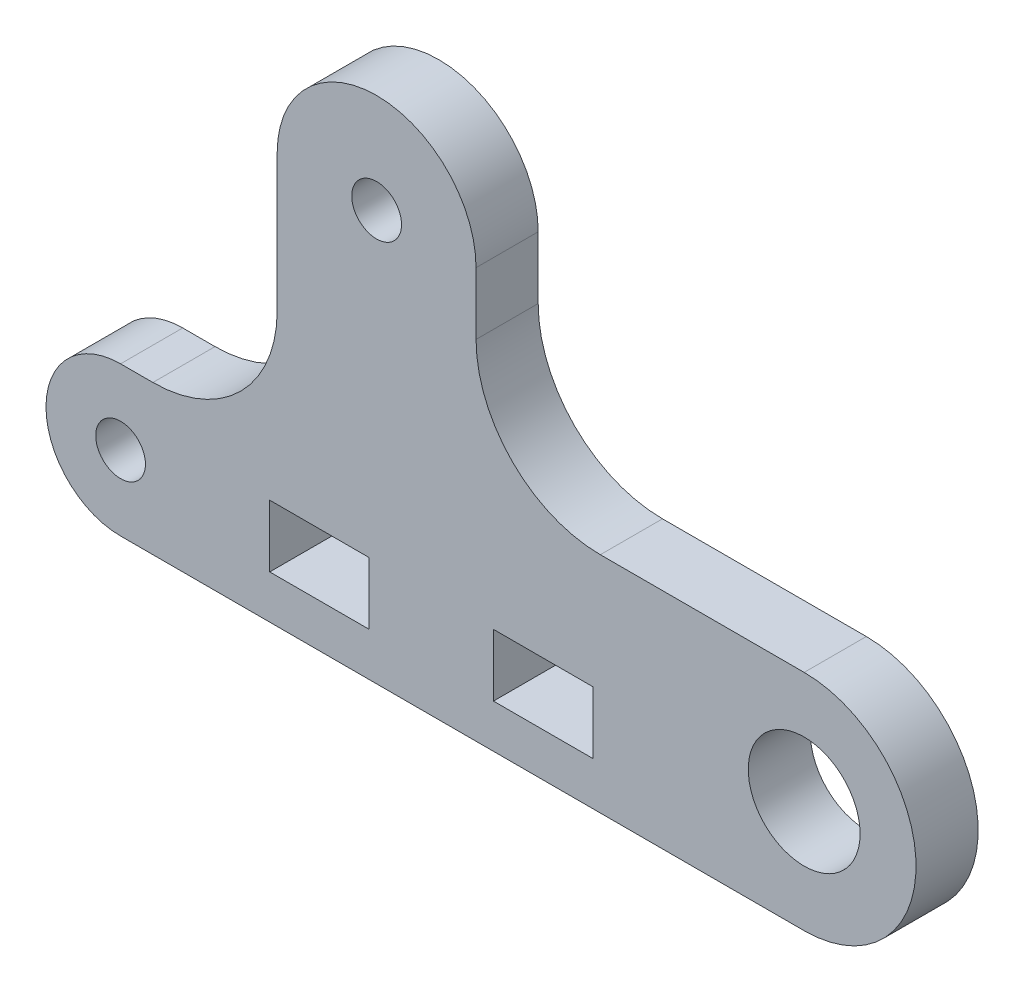
ISO-10303-21;
HEADER;
FILE_DESCRIPTION(('STEP AP214'),'2;1');
FILE_NAME('part.step','',(''),(''),'','','');
FILE_SCHEMA(('AUTOMOTIVE_DESIGN { 1 0 10303 214 1 1 1 1 }'));
ENDSEC;
DATA;
#1=APPLICATION_CONTEXT('core data for automotive mechanical design processes');
#2=APPLICATION_PROTOCOL_DEFINITION('international standard','automotive_design',2000,#1);
#3=PRODUCT_CONTEXT('',#1,'mechanical');
#4=PRODUCT('Part','Part','',(#3));
#5=PRODUCT_RELATED_PRODUCT_CATEGORY('part','',(#4));
#6=PRODUCT_DEFINITION_FORMATION('','',#4);
#7=PRODUCT_DEFINITION_CONTEXT('part definition',#1,'design');
#8=PRODUCT_DEFINITION('design','',#6,#7);
#9=PRODUCT_DEFINITION_SHAPE('','',#8);
#10=(LENGTH_UNIT() NAMED_UNIT(*) SI_UNIT(.MILLI.,.METRE.));
#11=(NAMED_UNIT(*) PLANE_ANGLE_UNIT() SI_UNIT($,.RADIAN.));
#12=(NAMED_UNIT(*) SI_UNIT($,.STERADIAN.) SOLID_ANGLE_UNIT());
#13=UNCERTAINTY_MEASURE_WITH_UNIT(LENGTH_MEASURE(1.E-05),#10,'distance_accuracy_value','');
#14=(GEOMETRIC_REPRESENTATION_CONTEXT(3) GLOBAL_UNCERTAINTY_ASSIGNED_CONTEXT((#13)) GLOBAL_UNIT_ASSIGNED_CONTEXT((#10,
#11,#12)) REPRESENTATION_CONTEXT('',''));
#15=CARTESIAN_POINT('',(0.,0.,0.));
#16=DIRECTION('',(0.,0.,1.));
#17=DIRECTION('',(1.,0.,0.));
#18=AXIS2_PLACEMENT_3D('',#15,#16,#17);
#19=CARTESIAN_POINT('',(-27.5,6.,2.5));
#20=DIRECTION('',(0.,0.,-1.));
#21=DIRECTION('',(-1.,0.,0.));
#22=AXIS2_PLACEMENT_3D('',#19,#20,#21);
#23=PLANE('',#22);
#24=DIRECTION('',(0.,-1.,0.));
#25=VECTOR('',#24,1.);
#26=CARTESIAN_POINT('',(-15.5,8.5,2.5));
#27=LINE('',#26,#25);
#28=CARTESIAN_POINT('',(-15.5,8.5,2.5));
#29=VERTEX_POINT('',#28);
#30=CARTESIAN_POINT('',(-15.5,3.5,2.5));
#31=VERTEX_POINT('',#30);
#32=EDGE_CURVE('E193',#29,#31,#27,.T.);
#33=ORIENTED_EDGE('',*,*,#32,.F.);
#34=DIRECTION('',(-1.,0.,0.));
#35=VECTOR('',#34,1.);
#36=CARTESIAN_POINT('',(-15.5,8.5,2.5));
#37=LINE('',#36,#35);
#38=CARTESIAN_POINT('',(-7.5,8.5,2.5));
#39=VERTEX_POINT('',#38);
#40=EDGE_CURVE('E201',#39,#29,#37,.T.);
#41=ORIENTED_EDGE('',*,*,#40,.F.);
#42=DIRECTION('',(0.,1.,0.));
#43=VECTOR('',#42,1.);
#44=CARTESIAN_POINT('',(-7.5,8.5,2.5));
#45=LINE('',#44,#43);
#46=CARTESIAN_POINT('',(-7.5,3.5,2.5));
#47=VERTEX_POINT('',#46);
#48=EDGE_CURVE('E198',#47,#39,#45,.T.);
#49=ORIENTED_EDGE('',*,*,#48,.F.);
#50=DIRECTION('',(1.,0.,0.));
#51=VECTOR('',#50,1.);
#52=CARTESIAN_POINT('',(-15.5,3.5,2.5));
#53=LINE('',#52,#51);
#54=EDGE_CURVE('E195',#31,#47,#53,.T.);
#55=ORIENTED_EDGE('',*,*,#54,.F.);
#56=EDGE_LOOP('',(#33,#41,#49,#55));
#57=FACE_BOUND('',#56,.T.);
#58=CARTESIAN_POINT('',(-27.5,6.,2.5));
#59=DIRECTION('',(0.,0.,1.));
#60=DIRECTION('',(-1.,0.,0.));
#61=AXIS2_PLACEMENT_3D('',#58,#59,#60);
#62=CIRCLE('',#61,6.);
#63=CARTESIAN_POINT('',(-27.5,12.,2.5));
#64=VERTEX_POINT('',#63);
#65=CARTESIAN_POINT('',(-27.5,0.,2.5));
#66=VERTEX_POINT('',#65);
#67=EDGE_CURVE('E242',#64,#66,#62,.T.);
#68=ORIENTED_EDGE('',*,*,#67,.T.);
#69=DIRECTION('',(1.,0.,0.));
#70=VECTOR('',#69,1.);
#71=CARTESIAN_POINT('',(-27.5,0.,2.5));
#72=LINE('',#71,#70);
#73=CARTESIAN_POINT('',(27.5,0.,2.5));
#74=VERTEX_POINT('',#73);
#75=EDGE_CURVE('E245',#66,#74,#72,.T.);
#76=ORIENTED_EDGE('',*,*,#75,.T.);
#77=CARTESIAN_POINT('',(27.5,9.,2.5));
#78=DIRECTION('',(0.,0.,1.));
#79=DIRECTION('',(1.,0.,0.));
#80=AXIS2_PLACEMENT_3D('',#77,#78,#79);
#81=CIRCLE('',#80,9.);
#82=CARTESIAN_POINT('',(27.5,18.,2.5));
#83=VERTEX_POINT('',#82);
#84=EDGE_CURVE('E248',#74,#83,#81,.T.);
#85=ORIENTED_EDGE('',*,*,#84,.T.);
#86=DIRECTION('',(-1.,0.,0.));
#87=VECTOR('',#86,1.);
#88=CARTESIAN_POINT('',(11.1000000000001,18.,2.5));
#89=LINE('',#88,#87);
#90=CARTESIAN_POINT('',(11.1000000000001,18.,2.5));
#91=VERTEX_POINT('',#90);
#92=EDGE_CURVE('E250',#83,#91,#89,.T.);
#93=ORIENTED_EDGE('',*,*,#92,.T.);
#94=CARTESIAN_POINT('',(11.1,28.,2.5));
#95=DIRECTION('',(0.,0.,-1.));
#96=DIRECTION('',(1.,0.,0.));
#97=AXIS2_PLACEMENT_3D('',#94,#95,#96);
#98=CIRCLE('',#97,10.);
#99=CARTESIAN_POINT('',(1.1,28.0000000000001,2.5));
#100=VERTEX_POINT('',#99);
#101=EDGE_CURVE('E252',#91,#100,#98,.T.);
#102=ORIENTED_EDGE('',*,*,#101,.T.);
#103=DIRECTION('',(0.,1.,0.));
#104=VECTOR('',#103,1.);
#105=CARTESIAN_POINT('',(1.1,33.,2.5));
#106=LINE('',#105,#104);
#107=CARTESIAN_POINT('',(1.1,33.,2.5));
#108=VERTEX_POINT('',#107);
#109=EDGE_CURVE('E254',#100,#108,#106,.T.);
#110=ORIENTED_EDGE('',*,*,#109,.T.);
#111=CARTESIAN_POINT('',(-6.9,33.,2.5));
#112=DIRECTION('',(0.,0.,1.));
#113=DIRECTION('',(-1.,0.,0.));
#114=AXIS2_PLACEMENT_3D('',#111,#112,#113);
#115=CIRCLE('',#114,8.);
#116=CARTESIAN_POINT('',(-14.9,33.,2.5));
#117=VERTEX_POINT('',#116);
#118=EDGE_CURVE('E256',#108,#117,#115,.T.);
#119=ORIENTED_EDGE('',*,*,#118,.T.);
#120=DIRECTION('',(0.,-1.,0.));
#121=VECTOR('',#120,1.);
#122=CARTESIAN_POINT('',(-14.9,22.0000000000001,2.5));
#123=LINE('',#122,#121);
#124=CARTESIAN_POINT('',(-14.9,22.0000000000001,2.5));
#125=VERTEX_POINT('',#124);
#126=EDGE_CURVE('E258',#117,#125,#123,.T.);
#127=ORIENTED_EDGE('',*,*,#126,.T.);
#128=CARTESIAN_POINT('',(-24.9,22.,2.5));
#129=DIRECTION('',(0.,0.,-1.));
#130=DIRECTION('',(1.,0.,0.));
#131=AXIS2_PLACEMENT_3D('',#128,#129,#130);
#132=CIRCLE('',#131,10.);
#133=CARTESIAN_POINT('',(-24.9000000000001,12.,2.5));
#134=VERTEX_POINT('',#133);
#135=EDGE_CURVE('E260',#125,#134,#132,.T.);
#136=ORIENTED_EDGE('',*,*,#135,.T.);
#137=DIRECTION('',(-1.,0.,0.));
#138=VECTOR('',#137,1.);
#139=CARTESIAN_POINT('',(-27.5,12.,2.5));
#140=LINE('',#139,#138);
#141=EDGE_CURVE('E262',#134,#64,#140,.T.);
#142=ORIENTED_EDGE('',*,*,#141,.T.);
#143=EDGE_LOOP('',(#68,#76,#85,#93,#102,#110,#119,#127,#136,#142));
#144=FACE_BOUND('',#143,.T.);
#145=CARTESIAN_POINT('',(27.5,9.,2.5));
#146=DIRECTION('',(0.,0.,1.));
#147=DIRECTION('',(1.,0.,0.));
#148=AXIS2_PLACEMENT_3D('',#145,#146,#147);
#149=CIRCLE('',#148,4.5);
#150=CARTESIAN_POINT('',(32.,9.,2.5));
#151=VERTEX_POINT('',#150);
#152=EDGE_CURVE('E236',#151,#151,#149,.T.);
#153=ORIENTED_EDGE('',*,*,#152,.F.);
#154=EDGE_LOOP('',(#153));
#155=FACE_BOUND('',#154,.T.);
#156=CARTESIAN_POINT('',(-27.5,6.,2.5));
#157=DIRECTION('',(0.,0.,1.));
#158=DIRECTION('',(1.,0.,0.));
#159=AXIS2_PLACEMENT_3D('',#156,#157,#158);
#160=CIRCLE('',#159,2.);
#161=CARTESIAN_POINT('',(-25.5,6.,2.5));
#162=VERTEX_POINT('',#161);
#163=EDGE_CURVE('E230',#162,#162,#160,.T.);
#164=ORIENTED_EDGE('',*,*,#163,.F.);
#165=EDGE_LOOP('',(#164));
#166=FACE_BOUND('',#165,.T.);
#167=CARTESIAN_POINT('',(-6.9,33.,2.5));
#168=DIRECTION('',(0.,0.,1.));
#169=DIRECTION('',(1.,0.,0.));
#170=AXIS2_PLACEMENT_3D('',#167,#168,#169);
#171=CIRCLE('',#170,2.00353968292891);
#172=CARTESIAN_POINT('',(-4.89646031707109,33.,2.5));
#173=VERTEX_POINT('',#172);
#174=EDGE_CURVE('E224',#173,#173,#171,.T.);
#175=ORIENTED_EDGE('',*,*,#174,.F.);
#176=EDGE_LOOP('',(#175));
#177=FACE_BOUND('',#176,.T.);
#178=DIRECTION('',(0.,-1.,0.));
#179=VECTOR('',#178,1.);
#180=CARTESIAN_POINT('',(2.5,8.5,2.5));
#181=LINE('',#180,#179);
#182=CARTESIAN_POINT('',(2.5,8.5,2.5));
#183=VERTEX_POINT('',#182);
#184=CARTESIAN_POINT('',(2.5,3.5,2.5));
#185=VERTEX_POINT('',#184);
#186=EDGE_CURVE('E157',#183,#185,#181,.T.);
#187=ORIENTED_EDGE('',*,*,#186,.F.);
#188=DIRECTION('',(-1.,0.,0.));
#189=VECTOR('',#188,1.);
#190=CARTESIAN_POINT('',(2.5,8.5,2.5));
#191=LINE('',#190,#189);
#192=CARTESIAN_POINT('',(10.5,8.5,2.5));
#193=VERTEX_POINT('',#192);
#194=EDGE_CURVE('E179',#193,#183,#191,.T.);
#195=ORIENTED_EDGE('',*,*,#194,.F.);
#196=DIRECTION('',(0.,1.,0.));
#197=VECTOR('',#196,1.);
#198=CARTESIAN_POINT('',(10.5,8.5,2.5));
#199=LINE('',#198,#197);
#200=CARTESIAN_POINT('',(10.5,3.5,2.5));
#201=VERTEX_POINT('',#200);
#202=EDGE_CURVE('E177',#201,#193,#199,.T.);
#203=ORIENTED_EDGE('',*,*,#202,.F.);
#204=DIRECTION('',(1.,0.,0.));
#205=VECTOR('',#204,1.);
#206=CARTESIAN_POINT('',(2.5,3.5,2.5));
#207=LINE('',#206,#205);
#208=EDGE_CURVE('E165',#185,#201,#207,.T.);
#209=ORIENTED_EDGE('',*,*,#208,.F.);
#210=EDGE_LOOP('',(#187,#195,#203,#209));
#211=FACE_BOUND('',#210,.T.);
#212=ADVANCED_FACE('F32',(#57,#144,#155,#166,#177,#211),#23,.F.);
#213=CARTESIAN_POINT('',(-27.5,6.,-2.5));
#214=DIRECTION('',(0.,0.,-1.));
#215=DIRECTION('',(-1.,0.,0.));
#216=AXIS2_PLACEMENT_3D('',#213,#214,#215);
#217=PLANE('',#216);
#218=CARTESIAN_POINT('',(-27.5,6.,-2.5));
#219=DIRECTION('',(0.,0.,1.));
#220=DIRECTION('',(1.,0.,0.));
#221=AXIS2_PLACEMENT_3D('',#218,#219,#220);
#222=CIRCLE('',#221,2.);
#223=CARTESIAN_POINT('',(-25.5,6.,-2.5));
#224=VERTEX_POINT('',#223);
#225=EDGE_CURVE('E227',#224,#224,#222,.T.);
#226=ORIENTED_EDGE('',*,*,#225,.T.);
#227=EDGE_LOOP('',(#226));
#228=FACE_BOUND('',#227,.T.);
#229=CARTESIAN_POINT('',(-27.5,6.,-2.5));
#230=DIRECTION('',(0.,0.,1.));
#231=DIRECTION('',(-1.,0.,0.));
#232=AXIS2_PLACEMENT_3D('',#229,#230,#231);
#233=CIRCLE('',#232,6.);
#234=CARTESIAN_POINT('',(-27.5,12.,-2.5));
#235=VERTEX_POINT('',#234);
#236=CARTESIAN_POINT('',(-27.5,0.,-2.5));
#237=VERTEX_POINT('',#236);
#238=EDGE_CURVE('E239',#235,#237,#233,.T.);
#239=ORIENTED_EDGE('',*,*,#238,.F.);
#240=DIRECTION('',(-1.,0.,0.));
#241=VECTOR('',#240,1.);
#242=CARTESIAN_POINT('',(-27.5,12.,-2.5));
#243=LINE('',#242,#241);
#244=CARTESIAN_POINT('',(-24.9000000000001,12.,-2.5));
#245=VERTEX_POINT('',#244);
#246=EDGE_CURVE('E246',#245,#235,#243,.T.);
#247=ORIENTED_EDGE('',*,*,#246,.F.);
#248=CARTESIAN_POINT('',(-24.9,22.,-2.5));
#249=DIRECTION('',(0.,0.,-1.));
#250=DIRECTION('',(1.,0.,0.));
#251=AXIS2_PLACEMENT_3D('',#248,#249,#250);
#252=CIRCLE('',#251,10.);
#253=CARTESIAN_POINT('',(-14.9,22.0000000000001,-2.5));
#254=VERTEX_POINT('',#253);
#255=EDGE_CURVE('E281',#254,#245,#252,.T.);
#256=ORIENTED_EDGE('',*,*,#255,.F.);
#257=DIRECTION('',(0.,-1.,0.));
#258=VECTOR('',#257,1.);
#259=CARTESIAN_POINT('',(-14.9,22.0000000000001,-2.5));
#260=LINE('',#259,#258);
#261=CARTESIAN_POINT('',(-14.9,33.,-2.5));
#262=VERTEX_POINT('',#261);
#263=EDGE_CURVE('E279',#262,#254,#260,.T.);
#264=ORIENTED_EDGE('',*,*,#263,.F.);
#265=CARTESIAN_POINT('',(-6.9,33.,-2.5));
#266=DIRECTION('',(0.,0.,1.));
#267=DIRECTION('',(-1.,0.,0.));
#268=AXIS2_PLACEMENT_3D('',#265,#266,#267);
#269=CIRCLE('',#268,8.);
#270=CARTESIAN_POINT('',(1.1,33.,-2.5));
#271=VERTEX_POINT('',#270);
#272=EDGE_CURVE('E277',#271,#262,#269,.T.);
#273=ORIENTED_EDGE('',*,*,#272,.F.);
#274=DIRECTION('',(0.,1.,0.));
#275=VECTOR('',#274,1.);
#276=CARTESIAN_POINT('',(1.1,33.,-2.5));
#277=LINE('',#276,#275);
#278=CARTESIAN_POINT('',(1.1,28.0000000000001,-2.5));
#279=VERTEX_POINT('',#278);
#280=EDGE_CURVE('E275',#279,#271,#277,.T.);
#281=ORIENTED_EDGE('',*,*,#280,.F.);
#282=CARTESIAN_POINT('',(11.1,28.,-2.5));
#283=DIRECTION('',(0.,0.,-1.));
#284=DIRECTION('',(1.,0.,0.));
#285=AXIS2_PLACEMENT_3D('',#282,#283,#284);
#286=CIRCLE('',#285,10.);
#287=CARTESIAN_POINT('',(11.1000000000001,18.,-2.5));
#288=VERTEX_POINT('',#287);
#289=EDGE_CURVE('E273',#288,#279,#286,.T.);
#290=ORIENTED_EDGE('',*,*,#289,.F.);
#291=DIRECTION('',(-1.,0.,0.));
#292=VECTOR('',#291,1.);
#293=CARTESIAN_POINT('',(11.1000000000001,18.,-2.5));
#294=LINE('',#293,#292);
#295=CARTESIAN_POINT('',(27.5,18.,-2.5));
#296=VERTEX_POINT('',#295);
#297=EDGE_CURVE('E271',#296,#288,#294,.T.);
#298=ORIENTED_EDGE('',*,*,#297,.F.);
#299=CARTESIAN_POINT('',(27.5,9.,-2.5));
#300=DIRECTION('',(0.,0.,1.));
#301=DIRECTION('',(1.,0.,0.));
#302=AXIS2_PLACEMENT_3D('',#299,#300,#301);
#303=CIRCLE('',#302,9.);
#304=CARTESIAN_POINT('',(27.5,0.,-2.5));
#305=VERTEX_POINT('',#304);
#306=EDGE_CURVE('E269',#305,#296,#303,.T.);
#307=ORIENTED_EDGE('',*,*,#306,.F.);
#308=DIRECTION('',(1.,0.,0.));
#309=VECTOR('',#308,1.);
#310=CARTESIAN_POINT('',(-27.5,0.,-2.5));
#311=LINE('',#310,#309);
#312=EDGE_CURVE('E267',#237,#305,#311,.T.);
#313=ORIENTED_EDGE('',*,*,#312,.F.);
#314=EDGE_LOOP('',(#239,#247,#256,#264,#273,#281,#290,#298,#307,#313));
#315=FACE_BOUND('',#314,.T.);
#316=CARTESIAN_POINT('',(27.5,9.,-2.5));
#317=DIRECTION('',(0.,0.,1.));
#318=DIRECTION('',(1.,0.,0.));
#319=AXIS2_PLACEMENT_3D('',#316,#317,#318);
#320=CIRCLE('',#319,4.5);
#321=CARTESIAN_POINT('',(32.,9.,-2.5));
#322=VERTEX_POINT('',#321);
#323=EDGE_CURVE('E233',#322,#322,#320,.T.);
#324=ORIENTED_EDGE('',*,*,#323,.T.);
#325=EDGE_LOOP('',(#324));
#326=FACE_BOUND('',#325,.T.);
#327=CARTESIAN_POINT('',(-6.9,33.,-2.5));
#328=DIRECTION('',(0.,0.,1.));
#329=DIRECTION('',(1.,0.,0.));
#330=AXIS2_PLACEMENT_3D('',#327,#328,#329);
#331=CIRCLE('',#330,2.00353968292891);
#332=CARTESIAN_POINT('',(-4.89646031707109,33.,-2.5));
#333=VERTEX_POINT('',#332);
#334=EDGE_CURVE('E223',#333,#333,#331,.T.);
#335=ORIENTED_EDGE('',*,*,#334,.T.);
#336=EDGE_LOOP('',(#335));
#337=FACE_BOUND('',#336,.T.);
#338=DIRECTION('',(-1.,0.,0.));
#339=VECTOR('',#338,1.);
#340=CARTESIAN_POINT('',(-15.5,8.5,-2.5));
#341=LINE('',#340,#339);
#342=CARTESIAN_POINT('',(-7.5,8.5,-2.5));
#343=VERTEX_POINT('',#342);
#344=CARTESIAN_POINT('',(-15.5,8.5,-2.5));
#345=VERTEX_POINT('',#344);
#346=EDGE_CURVE('E196',#343,#345,#341,.T.);
#347=ORIENTED_EDGE('',*,*,#346,.T.);
#348=DIRECTION('',(0.,-1.,0.));
#349=VECTOR('',#348,1.);
#350=CARTESIAN_POINT('',(-15.5,8.5,-2.5));
#351=LINE('',#350,#349);
#352=CARTESIAN_POINT('',(-15.5,3.5,-2.5));
#353=VERTEX_POINT('',#352);
#354=EDGE_CURVE('E173',#345,#353,#351,.T.);
#355=ORIENTED_EDGE('',*,*,#354,.T.);
#356=DIRECTION('',(1.,0.,0.));
#357=VECTOR('',#356,1.);
#358=CARTESIAN_POINT('',(-15.5,3.5,-2.5));
#359=LINE('',#358,#357);
#360=CARTESIAN_POINT('',(-7.5,3.5,-2.5));
#361=VERTEX_POINT('',#360);
#362=EDGE_CURVE('E206',#353,#361,#359,.T.);
#363=ORIENTED_EDGE('',*,*,#362,.T.);
#364=DIRECTION('',(0.,1.,0.));
#365=VECTOR('',#364,1.);
#366=CARTESIAN_POINT('',(-7.5,8.5,-2.5));
#367=LINE('',#366,#365);
#368=EDGE_CURVE('E209',#361,#343,#367,.T.);
#369=ORIENTED_EDGE('',*,*,#368,.T.);
#370=EDGE_LOOP('',(#347,#355,#363,#369));
#371=FACE_BOUND('',#370,.T.);
#372=DIRECTION('',(-1.,0.,0.));
#373=VECTOR('',#372,1.);
#374=CARTESIAN_POINT('',(2.5,8.5,-2.5));
#375=LINE('',#374,#373);
#376=CARTESIAN_POINT('',(10.5,8.5,-2.5));
#377=VERTEX_POINT('',#376);
#378=CARTESIAN_POINT('',(2.5,8.5,-2.5));
#379=VERTEX_POINT('',#378);
#380=EDGE_CURVE('E166',#377,#379,#375,.T.);
#381=ORIENTED_EDGE('',*,*,#380,.T.);
#382=DIRECTION('',(0.,-1.,0.));
#383=VECTOR('',#382,1.);
#384=CARTESIAN_POINT('',(2.5,8.5,-2.5));
#385=LINE('',#384,#383);
#386=CARTESIAN_POINT('',(2.5,3.5,-2.5));
#387=VERTEX_POINT('',#386);
#388=EDGE_CURVE('E55',#379,#387,#385,.T.);
#389=ORIENTED_EDGE('',*,*,#388,.T.);
#390=DIRECTION('',(1.,0.,0.));
#391=VECTOR('',#390,1.);
#392=CARTESIAN_POINT('',(2.5,3.5,-2.5));
#393=LINE('',#392,#391);
#394=CARTESIAN_POINT('',(10.5,3.5,-2.5));
#395=VERTEX_POINT('',#394);
#396=EDGE_CURVE('E172',#387,#395,#393,.T.);
#397=ORIENTED_EDGE('',*,*,#396,.T.);
#398=DIRECTION('',(0.,1.,0.));
#399=VECTOR('',#398,1.);
#400=CARTESIAN_POINT('',(10.5,8.5,-2.5));
#401=LINE('',#400,#399);
#402=EDGE_CURVE('E185',#395,#377,#401,.T.);
#403=ORIENTED_EDGE('',*,*,#402,.T.);
#404=EDGE_LOOP('',(#381,#389,#397,#403));
#405=FACE_BOUND('',#404,.T.);
#406=ADVANCED_FACE('F317',(#228,#315,#326,#337,#371,#405),#217,.T.);
#407=CARTESIAN_POINT('',(-27.5,6.,2.5));
#408=DIRECTION('',(0.,0.,-1.));
#409=DIRECTION('',(-1.,0.,0.));
#410=AXIS2_PLACEMENT_3D('',#407,#408,#409);
#411=CYLINDRICAL_SURFACE('',#410,6.);
#412=ORIENTED_EDGE('',*,*,#238,.T.);
#413=DIRECTION('',(0.,0.,-1.));
#414=VECTOR('',#413,1.);
#415=CARTESIAN_POINT('',(-27.5,0.,2.5));
#416=LINE('',#415,#414);
#417=EDGE_CURVE('E11',#66,#237,#416,.T.);
#418=ORIENTED_EDGE('',*,*,#417,.F.);
#419=ORIENTED_EDGE('',*,*,#67,.F.);
#420=DIRECTION('',(0.,0.,-1.));
#421=VECTOR('',#420,1.);
#422=CARTESIAN_POINT('',(-27.5,12.,2.5));
#423=LINE('',#422,#421);
#424=EDGE_CURVE('E264',#64,#235,#423,.T.);
#425=ORIENTED_EDGE('',*,*,#424,.T.);
#426=EDGE_LOOP('',(#412,#418,#419,#425));
#427=FACE_BOUND('',#426,.T.);
#428=ADVANCED_FACE('F34',(#427),#411,.T.);
#429=CARTESIAN_POINT('',(-27.5,0.,2.5));
#430=DIRECTION('',(0.,1.,0.));
#431=DIRECTION('',(0.,0.,1.));
#432=AXIS2_PLACEMENT_3D('',#429,#430,#431);
#433=PLANE('',#432);
#434=ORIENTED_EDGE('',*,*,#312,.T.);
#435=DIRECTION('',(0.,0.,-1.));
#436=VECTOR('',#435,1.);
#437=CARTESIAN_POINT('',(27.5,0.,2.5));
#438=LINE('',#437,#436);
#439=EDGE_CURVE('E40',#74,#305,#438,.T.);
#440=ORIENTED_EDGE('',*,*,#439,.F.);
#441=ORIENTED_EDGE('',*,*,#75,.F.);
#442=ORIENTED_EDGE('',*,*,#417,.T.);
#443=EDGE_LOOP('',(#434,#440,#441,#442));
#444=FACE_BOUND('',#443,.T.);
#445=ADVANCED_FACE('F335',(#444),#433,.F.);
#446=CARTESIAN_POINT('',(27.5,9.,2.5));
#447=DIRECTION('',(0.,0.,-1.));
#448=DIRECTION('',(-1.,0.,0.));
#449=AXIS2_PLACEMENT_3D('',#446,#447,#448);
#450=CYLINDRICAL_SURFACE('',#449,9.);
#451=ORIENTED_EDGE('',*,*,#306,.T.);
#452=DIRECTION('',(0.,0.,-1.));
#453=VECTOR('',#452,1.);
#454=CARTESIAN_POINT('',(27.5,18.,2.5));
#455=LINE('',#454,#453);
#456=EDGE_CURVE('E304',#83,#296,#455,.T.);
#457=ORIENTED_EDGE('',*,*,#456,.F.);
#458=ORIENTED_EDGE('',*,*,#84,.F.);
#459=ORIENTED_EDGE('',*,*,#439,.T.);
#460=EDGE_LOOP('',(#451,#457,#458,#459));
#461=FACE_BOUND('',#460,.T.);
#462=ADVANCED_FACE('F311',(#461),#450,.T.);
#463=CARTESIAN_POINT('',(11.1000000000001,18.,2.5));
#464=DIRECTION('',(0.,-1.,0.));
#465=DIRECTION('',(0.,0.,-1.));
#466=AXIS2_PLACEMENT_3D('',#463,#464,#465);
#467=PLANE('',#466);
#468=ORIENTED_EDGE('',*,*,#297,.T.);
#469=DIRECTION('',(0.,0.,-1.));
#470=VECTOR('',#469,1.);
#471=CARTESIAN_POINT('',(11.1000000000001,18.,2.5));
#472=LINE('',#471,#470);
#473=EDGE_CURVE('E301',#91,#288,#472,.T.);
#474=ORIENTED_EDGE('',*,*,#473,.F.);
#475=ORIENTED_EDGE('',*,*,#92,.F.);
#476=ORIENTED_EDGE('',*,*,#456,.T.);
#477=EDGE_LOOP('',(#468,#474,#475,#476));
#478=FACE_BOUND('',#477,.T.);
#479=ADVANCED_FACE('F323',(#478),#467,.F.);
#480=CARTESIAN_POINT('',(11.1,28.,2.5));
#481=DIRECTION('',(0.,0.,-1.));
#482=DIRECTION('',(-1.,0.,0.));
#483=AXIS2_PLACEMENT_3D('',#480,#481,#482);
#484=CYLINDRICAL_SURFACE('',#483,10.);
#485=ORIENTED_EDGE('',*,*,#289,.T.);
#486=DIRECTION('',(0.,0.,-1.));
#487=VECTOR('',#486,1.);
#488=CARTESIAN_POINT('',(1.1,28.0000000000001,2.5));
#489=LINE('',#488,#487);
#490=EDGE_CURVE('E298',#100,#279,#489,.T.);
#491=ORIENTED_EDGE('',*,*,#490,.F.);
#492=ORIENTED_EDGE('',*,*,#101,.F.);
#493=ORIENTED_EDGE('',*,*,#473,.T.);
#494=EDGE_LOOP('',(#485,#491,#492,#493));
#495=FACE_BOUND('',#494,.T.);
#496=ADVANCED_FACE('F327',(#495),#484,.F.);
#497=CARTESIAN_POINT('',(1.1,33.,2.5));
#498=DIRECTION('',(-1.,0.,0.));
#499=DIRECTION('',(0.,0.,1.));
#500=AXIS2_PLACEMENT_3D('',#497,#498,#499);
#501=PLANE('',#500);
#502=ORIENTED_EDGE('',*,*,#280,.T.);
#503=DIRECTION('',(0.,0.,-1.));
#504=VECTOR('',#503,1.);
#505=CARTESIAN_POINT('',(1.1,33.,2.5));
#506=LINE('',#505,#504);
#507=EDGE_CURVE('E295',#108,#271,#506,.T.);
#508=ORIENTED_EDGE('',*,*,#507,.F.);
#509=ORIENTED_EDGE('',*,*,#109,.F.);
#510=ORIENTED_EDGE('',*,*,#490,.T.);
#511=EDGE_LOOP('',(#502,#508,#509,#510));
#512=FACE_BOUND('',#511,.T.);
#513=ADVANCED_FACE('F358',(#512),#501,.F.);
#514=CARTESIAN_POINT('',(-6.9,33.,2.5));
#515=DIRECTION('',(0.,0.,-1.));
#516=DIRECTION('',(-1.,0.,0.));
#517=AXIS2_PLACEMENT_3D('',#514,#515,#516);
#518=CYLINDRICAL_SURFACE('',#517,8.);
#519=ORIENTED_EDGE('',*,*,#272,.T.);
#520=DIRECTION('',(0.,0.,-1.));
#521=VECTOR('',#520,1.);
#522=CARTESIAN_POINT('',(-14.9,33.,2.5));
#523=LINE('',#522,#521);
#524=EDGE_CURVE('E292',#117,#262,#523,.T.);
#525=ORIENTED_EDGE('',*,*,#524,.F.);
#526=ORIENTED_EDGE('',*,*,#118,.F.);
#527=ORIENTED_EDGE('',*,*,#507,.T.);
#528=EDGE_LOOP('',(#519,#525,#526,#527));
#529=FACE_BOUND('',#528,.T.);
#530=ADVANCED_FACE('F355',(#529),#518,.T.);
#531=CARTESIAN_POINT('',(-14.9,22.0000000000001,2.5));
#532=DIRECTION('',(1.,0.,0.));
#533=DIRECTION('',(0.,0.,-1.));
#534=AXIS2_PLACEMENT_3D('',#531,#532,#533);
#535=PLANE('',#534);
#536=ORIENTED_EDGE('',*,*,#263,.T.);
#537=DIRECTION('',(0.,0.,-1.));
#538=VECTOR('',#537,1.);
#539=CARTESIAN_POINT('',(-14.9,22.0000000000001,2.5));
#540=LINE('',#539,#538);
#541=EDGE_CURVE('E289',#125,#254,#540,.T.);
#542=ORIENTED_EDGE('',*,*,#541,.F.);
#543=ORIENTED_EDGE('',*,*,#126,.F.);
#544=ORIENTED_EDGE('',*,*,#524,.T.);
#545=EDGE_LOOP('',(#536,#542,#543,#544));
#546=FACE_BOUND('',#545,.T.);
#547=ADVANCED_FACE('F351',(#546),#535,.F.);
#548=CARTESIAN_POINT('',(-24.9,22.,2.5));
#549=DIRECTION('',(0.,0.,-1.));
#550=DIRECTION('',(-1.,0.,0.));
#551=AXIS2_PLACEMENT_3D('',#548,#549,#550);
#552=CYLINDRICAL_SURFACE('',#551,10.);
#553=ORIENTED_EDGE('',*,*,#255,.T.);
#554=DIRECTION('',(0.,0.,-1.));
#555=VECTOR('',#554,1.);
#556=CARTESIAN_POINT('',(-24.9000000000001,12.,2.5));
#557=LINE('',#556,#555);
#558=EDGE_CURVE('E286',#134,#245,#557,.T.);
#559=ORIENTED_EDGE('',*,*,#558,.F.);
#560=ORIENTED_EDGE('',*,*,#135,.F.);
#561=ORIENTED_EDGE('',*,*,#541,.T.);
#562=EDGE_LOOP('',(#553,#559,#560,#561));
#563=FACE_BOUND('',#562,.T.);
#564=ADVANCED_FACE('F347',(#563),#552,.F.);
#565=CARTESIAN_POINT('',(-27.5,12.,2.5));
#566=DIRECTION('',(0.,-1.,0.));
#567=DIRECTION('',(0.,0.,-1.));
#568=AXIS2_PLACEMENT_3D('',#565,#566,#567);
#569=PLANE('',#568);
#570=ORIENTED_EDGE('',*,*,#246,.T.);
#571=ORIENTED_EDGE('',*,*,#424,.F.);
#572=ORIENTED_EDGE('',*,*,#141,.F.);
#573=ORIENTED_EDGE('',*,*,#558,.T.);
#574=EDGE_LOOP('',(#570,#571,#572,#573));
#575=FACE_BOUND('',#574,.T.);
#576=ADVANCED_FACE('F342',(#575),#569,.F.);
#577=CARTESIAN_POINT('',(27.5,9.,2.5));
#578=DIRECTION('',(0.,0.,-1.));
#579=DIRECTION('',(-1.,0.,0.));
#580=AXIS2_PLACEMENT_3D('',#577,#578,#579);
#581=CYLINDRICAL_SURFACE('',#580,4.5);
#582=ORIENTED_EDGE('',*,*,#152,.T.);
#583=EDGE_LOOP('',(#582));
#584=FACE_BOUND('',#583,.T.);
#585=ORIENTED_EDGE('',*,*,#323,.F.);
#586=EDGE_LOOP('',(#585));
#587=FACE_BOUND('',#586,.T.);
#588=ADVANCED_FACE('F377',(#584,#587),#581,.F.);
#589=CARTESIAN_POINT('',(-27.5,6.,2.5));
#590=DIRECTION('',(0.,0.,-1.));
#591=DIRECTION('',(-1.,0.,0.));
#592=AXIS2_PLACEMENT_3D('',#589,#590,#591);
#593=CYLINDRICAL_SURFACE('',#592,2.);
#594=ORIENTED_EDGE('',*,*,#163,.T.);
#595=EDGE_LOOP('',(#594));
#596=FACE_BOUND('',#595,.T.);
#597=ORIENTED_EDGE('',*,*,#225,.F.);
#598=EDGE_LOOP('',(#597));
#599=FACE_BOUND('',#598,.T.);
#600=ADVANCED_FACE('F403',(#596,#599),#593,.F.);
#601=CARTESIAN_POINT('',(-6.9,33.,2.5));
#602=DIRECTION('',(0.,0.,-1.));
#603=DIRECTION('',(-1.,0.,0.));
#604=AXIS2_PLACEMENT_3D('',#601,#602,#603);
#605=CYLINDRICAL_SURFACE('',#604,2.00353968292891);
#606=ORIENTED_EDGE('',*,*,#174,.T.);
#607=EDGE_LOOP('',(#606));
#608=FACE_BOUND('',#607,.T.);
#609=ORIENTED_EDGE('',*,*,#334,.F.);
#610=EDGE_LOOP('',(#609));
#611=FACE_BOUND('',#610,.T.);
#612=ADVANCED_FACE('F410',(#608,#611),#605,.F.);
#613=CARTESIAN_POINT('',(-15.5,8.5,2.5));
#614=DIRECTION('',(1.,0.,0.));
#615=DIRECTION('',(0.,0.,-1.));
#616=AXIS2_PLACEMENT_3D('',#613,#614,#615);
#617=PLANE('',#616);
#618=ORIENTED_EDGE('',*,*,#354,.F.);
#619=DIRECTION('',(0.,0.,-1.));
#620=VECTOR('',#619,1.);
#621=CARTESIAN_POINT('',(-15.5,8.5,2.5));
#622=LINE('',#621,#620);
#623=EDGE_CURVE('E203',#29,#345,#622,.T.);
#624=ORIENTED_EDGE('',*,*,#623,.F.);
#625=ORIENTED_EDGE('',*,*,#32,.T.);
#626=DIRECTION('',(0.,0.,-1.));
#627=VECTOR('',#626,1.);
#628=CARTESIAN_POINT('',(-15.5,3.5,2.5));
#629=LINE('',#628,#627);
#630=EDGE_CURVE('E220',#31,#353,#629,.T.);
#631=ORIENTED_EDGE('',*,*,#630,.T.);
#632=EDGE_LOOP('',(#618,#624,#625,#631));
#633=FACE_BOUND('',#632,.T.);
#634=ADVANCED_FACE('F417',(#633),#617,.T.);
#635=CARTESIAN_POINT('',(-15.5,3.5,2.5));
#636=DIRECTION('',(0.,1.,0.));
#637=DIRECTION('',(0.,0.,1.));
#638=AXIS2_PLACEMENT_3D('',#635,#636,#637);
#639=PLANE('',#638);
#640=ORIENTED_EDGE('',*,*,#362,.F.);
#641=ORIENTED_EDGE('',*,*,#630,.F.);
#642=ORIENTED_EDGE('',*,*,#54,.T.);
#643=DIRECTION('',(0.,0.,-1.));
#644=VECTOR('',#643,1.);
#645=CARTESIAN_POINT('',(-7.5,3.5,2.5));
#646=LINE('',#645,#644);
#647=EDGE_CURVE('E218',#47,#361,#646,.T.);
#648=ORIENTED_EDGE('',*,*,#647,.T.);
#649=EDGE_LOOP('',(#640,#641,#642,#648));
#650=FACE_BOUND('',#649,.T.);
#651=ADVANCED_FACE('F425',(#650),#639,.T.);
#652=CARTESIAN_POINT('',(-7.5,8.5,2.5));
#653=DIRECTION('',(-1.,0.,0.));
#654=DIRECTION('',(0.,0.,1.));
#655=AXIS2_PLACEMENT_3D('',#652,#653,#654);
#656=PLANE('',#655);
#657=ORIENTED_EDGE('',*,*,#368,.F.);
#658=ORIENTED_EDGE('',*,*,#647,.F.);
#659=ORIENTED_EDGE('',*,*,#48,.T.);
#660=DIRECTION('',(0.,0.,-1.));
#661=VECTOR('',#660,1.);
#662=CARTESIAN_POINT('',(-7.5,8.5,2.5));
#663=LINE('',#662,#661);
#664=EDGE_CURVE('E216',#39,#343,#663,.T.);
#665=ORIENTED_EDGE('',*,*,#664,.T.);
#666=EDGE_LOOP('',(#657,#658,#659,#665));
#667=FACE_BOUND('',#666,.T.);
#668=ADVANCED_FACE('F433',(#667),#656,.T.);
#669=CARTESIAN_POINT('',(-15.5,8.5,2.5));
#670=DIRECTION('',(0.,-1.,0.));
#671=DIRECTION('',(0.,0.,-1.));
#672=AXIS2_PLACEMENT_3D('',#669,#670,#671);
#673=PLANE('',#672);
#674=ORIENTED_EDGE('',*,*,#346,.F.);
#675=ORIENTED_EDGE('',*,*,#664,.F.);
#676=ORIENTED_EDGE('',*,*,#40,.T.);
#677=ORIENTED_EDGE('',*,*,#623,.T.);
#678=EDGE_LOOP('',(#674,#675,#676,#677));
#679=FACE_BOUND('',#678,.T.);
#680=ADVANCED_FACE('F441',(#679),#673,.T.);
#681=CARTESIAN_POINT('',(2.5,8.5,2.5));
#682=DIRECTION('',(1.,0.,0.));
#683=DIRECTION('',(0.,1.,0.));
#684=AXIS2_PLACEMENT_3D('',#681,#682,#683);
#685=PLANE('',#684);
#686=ORIENTED_EDGE('',*,*,#388,.F.);
#687=DIRECTION('',(0.,0.,-1.));
#688=VECTOR('',#687,1.);
#689=CARTESIAN_POINT('',(2.5,8.5,2.5));
#690=LINE('',#689,#688);
#691=EDGE_CURVE('E161',#183,#379,#690,.T.);
#692=ORIENTED_EDGE('',*,*,#691,.F.);
#693=ORIENTED_EDGE('',*,*,#186,.T.);
#694=DIRECTION('',(0.,0.,-1.));
#695=VECTOR('',#694,1.);
#696=CARTESIAN_POINT('',(2.5,3.5,2.5));
#697=LINE('',#696,#695);
#698=EDGE_CURVE('E160',#185,#387,#697,.T.);
#699=ORIENTED_EDGE('',*,*,#698,.T.);
#700=EDGE_LOOP('',(#686,#692,#693,#699));
#701=FACE_BOUND('',#700,.T.);
#702=ADVANCED_FACE('F159',(#701),#685,.T.);
#703=CARTESIAN_POINT('',(2.5,3.5,2.5));
#704=DIRECTION('',(0.,1.,0.));
#705=DIRECTION('',(0.,0.,1.));
#706=AXIS2_PLACEMENT_3D('',#703,#704,#705);
#707=PLANE('',#706);
#708=ORIENTED_EDGE('',*,*,#396,.F.);
#709=ORIENTED_EDGE('',*,*,#698,.F.);
#710=ORIENTED_EDGE('',*,*,#208,.T.);
#711=DIRECTION('',(0.,0.,-1.));
#712=VECTOR('',#711,1.);
#713=CARTESIAN_POINT('',(10.5,3.5,2.5));
#714=LINE('',#713,#712);
#715=EDGE_CURVE('E174',#201,#395,#714,.T.);
#716=ORIENTED_EDGE('',*,*,#715,.T.);
#717=EDGE_LOOP('',(#708,#709,#710,#716));
#718=FACE_BOUND('',#717,.T.);
#719=ADVANCED_FACE('F169',(#718),#707,.T.);
#720=CARTESIAN_POINT('',(10.5,8.5,2.5));
#721=DIRECTION('',(-1.,0.,0.));
#722=DIRECTION('',(0.,0.,1.));
#723=AXIS2_PLACEMENT_3D('',#720,#721,#722);
#724=PLANE('',#723);
#725=ORIENTED_EDGE('',*,*,#402,.F.);
#726=ORIENTED_EDGE('',*,*,#715,.F.);
#727=ORIENTED_EDGE('',*,*,#202,.T.);
#728=DIRECTION('',(0.,0.,-1.));
#729=VECTOR('',#728,1.);
#730=CARTESIAN_POINT('',(10.5,8.5,2.5));
#731=LINE('',#730,#729);
#732=EDGE_CURVE('E47',#193,#377,#731,.T.);
#733=ORIENTED_EDGE('',*,*,#732,.T.);
#734=EDGE_LOOP('',(#725,#726,#727,#733));
#735=FACE_BOUND('',#734,.T.);
#736=ADVANCED_FACE('F462',(#735),#724,.T.);
#737=CARTESIAN_POINT('',(2.5,8.5,2.5));
#738=DIRECTION('',(0.,-1.,0.));
#739=DIRECTION('',(0.,0.,-1.));
#740=AXIS2_PLACEMENT_3D('',#737,#738,#739);
#741=PLANE('',#740);
#742=ORIENTED_EDGE('',*,*,#380,.F.);
#743=ORIENTED_EDGE('',*,*,#732,.F.);
#744=ORIENTED_EDGE('',*,*,#194,.T.);
#745=ORIENTED_EDGE('',*,*,#691,.T.);
#746=EDGE_LOOP('',(#742,#743,#744,#745));
#747=FACE_BOUND('',#746,.T.);
#748=ADVANCED_FACE('F469',(#747),#741,.T.);
#749=CLOSED_SHELL('',(#212,#406,#428,#445,#462,#479,#496,#513,#530,#547,#564,#576,#588,#600,
#612,#634,#651,#668,#680,#702,#719,#736,#748));
#750=MANIFOLD_SOLID_BREP('B2',#749);
#751=ADVANCED_BREP_SHAPE_REPRESENTATION('',(#18,#750),#14);
#752=SHAPE_DEFINITION_REPRESENTATION(#9,#751);
ENDSEC;
END-ISO-10303-21;
